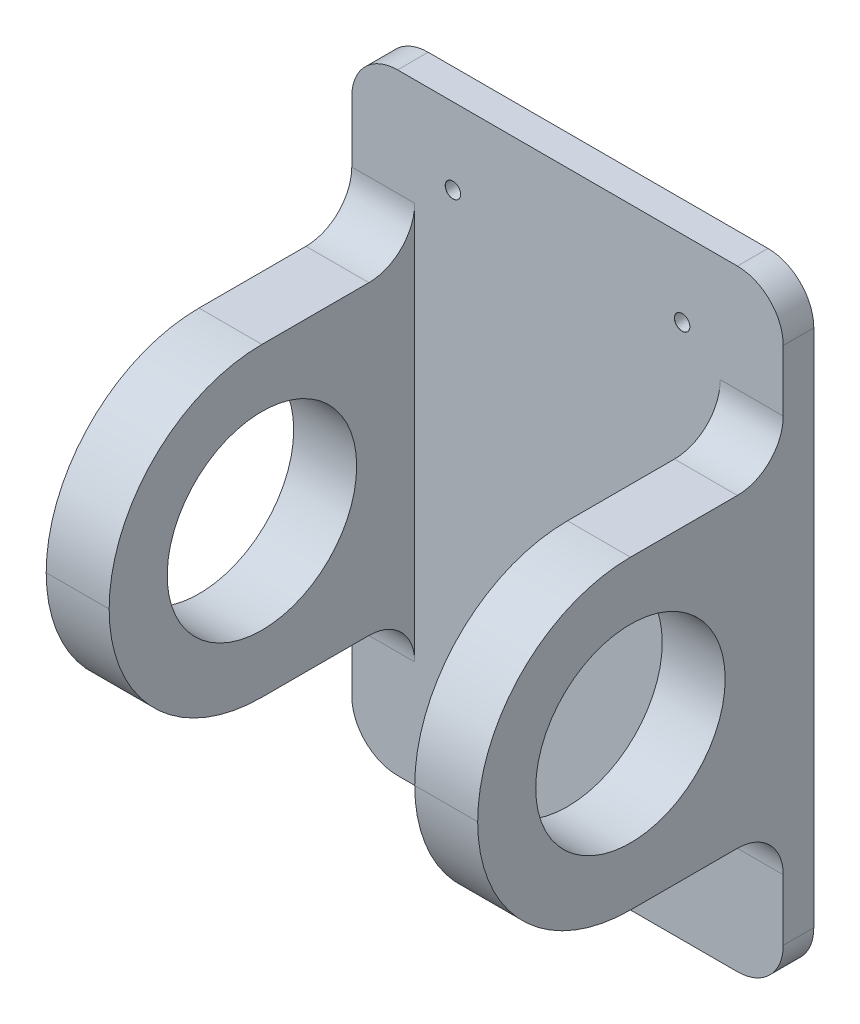
ISO-10303-21;
HEADER;
FILE_DESCRIPTION(('STEP AP214'),'2;1');
FILE_NAME('part.step','',(''),(''),'','','');
FILE_SCHEMA(('AUTOMOTIVE_DESIGN { 1 0 10303 214 1 1 1 1 }'));
ENDSEC;
DATA;
#1=APPLICATION_CONTEXT('core data for automotive mechanical design processes');
#2=APPLICATION_PROTOCOL_DEFINITION('international standard','automotive_design',2000,#1);
#3=PRODUCT_CONTEXT('',#1,'mechanical');
#4=PRODUCT('Part','Part','',(#3));
#5=PRODUCT_RELATED_PRODUCT_CATEGORY('part','',(#4));
#6=PRODUCT_DEFINITION_FORMATION('','',#4);
#7=PRODUCT_DEFINITION_CONTEXT('part definition',#1,'design');
#8=PRODUCT_DEFINITION('design','',#6,#7);
#9=PRODUCT_DEFINITION_SHAPE('','',#8);
#10=(LENGTH_UNIT() NAMED_UNIT(*) SI_UNIT(.MILLI.,.METRE.));
#11=(NAMED_UNIT(*) PLANE_ANGLE_UNIT() SI_UNIT($,.RADIAN.));
#12=(NAMED_UNIT(*) SI_UNIT($,.STERADIAN.) SOLID_ANGLE_UNIT());
#13=UNCERTAINTY_MEASURE_WITH_UNIT(LENGTH_MEASURE(1.E-05),#10,'distance_accuracy_value','');
#14=(GEOMETRIC_REPRESENTATION_CONTEXT(3) GLOBAL_UNCERTAINTY_ASSIGNED_CONTEXT((#13)) GLOBAL_UNIT_ASSIGNED_CONTEXT((#10,
#11,#12)) REPRESENTATION_CONTEXT('',''));
#15=CARTESIAN_POINT('',(0.,0.,0.));
#16=DIRECTION('',(0.,0.,1.));
#17=DIRECTION('',(1.,0.,0.));
#18=AXIS2_PLACEMENT_3D('',#15,#16,#17);
#19=CARTESIAN_POINT('',(0.,0.,0.));
#20=DIRECTION('',(0.,0.,1.));
#21=DIRECTION('',(1.,0.,0.));
#22=AXIS2_PLACEMENT_3D('',#19,#20,#21);
#23=PLANE('',#22);
#24=CARTESIAN_POINT('',(-37.5,-75.,0.));
#25=DIRECTION('',(0.,0.,1.));
#26=DIRECTION('',(1.,0.,0.));
#27=AXIS2_PLACEMENT_3D('',#24,#25,#26);
#28=CIRCLE('',#27,2.525);
#29=CARTESIAN_POINT('',(-34.975,-75.,0.));
#30=VERTEX_POINT('',#29);
#31=EDGE_CURVE('E414',#30,#30,#28,.T.);
#32=ORIENTED_EDGE('',*,*,#31,.F.);
#33=EDGE_LOOP('',(#32));
#34=FACE_BOUND('',#33,.T.);
#35=CARTESIAN_POINT('',(37.5,-75.,0.));
#36=DIRECTION('',(0.,0.,1.));
#37=DIRECTION('',(1.,0.,0.));
#38=AXIS2_PLACEMENT_3D('',#35,#36,#37);
#39=CIRCLE('',#38,2.525);
#40=CARTESIAN_POINT('',(40.025,-75.,0.));
#41=VERTEX_POINT('',#40);
#42=EDGE_CURVE('E406',#41,#41,#39,.T.);
#43=ORIENTED_EDGE('',*,*,#42,.F.);
#44=EDGE_LOOP('',(#43));
#45=FACE_BOUND('',#44,.T.);
#46=CARTESIAN_POINT('',(-37.5,75.,0.));
#47=DIRECTION('',(0.,0.,1.));
#48=DIRECTION('',(1.,0.,0.));
#49=AXIS2_PLACEMENT_3D('',#46,#47,#48);
#50=CIRCLE('',#49,2.525);
#51=CARTESIAN_POINT('',(-34.975,75.,0.));
#52=VERTEX_POINT('',#51);
#53=EDGE_CURVE('E400',#52,#52,#50,.T.);
#54=ORIENTED_EDGE('',*,*,#53,.F.);
#55=EDGE_LOOP('',(#54));
#56=FACE_BOUND('',#55,.T.);
#57=CARTESIAN_POINT('',(37.5,75.,0.));
#58=DIRECTION('',(0.,0.,1.));
#59=DIRECTION('',(1.,0.,0.));
#60=AXIS2_PLACEMENT_3D('',#57,#58,#59);
#61=CIRCLE('',#60,2.525);
#62=CARTESIAN_POINT('',(40.025,75.,0.));
#63=VERTEX_POINT('',#62);
#64=EDGE_CURVE('E387',#63,#63,#61,.T.);
#65=ORIENTED_EDGE('',*,*,#64,.F.);
#66=EDGE_LOOP('',(#65));
#67=FACE_BOUND('',#66,.T.);
#68=DIRECTION('',(0.,-1.,0.));
#69=VECTOR('',#68,1.);
#70=CARTESIAN_POINT('',(-70.6,-100.,0.));
#71=LINE('',#70,#69);
#72=CARTESIAN_POINT('',(-70.6,-65.,0.));
#73=VERTEX_POINT('',#72);
#74=CARTESIAN_POINT('',(-70.6,-85.,0.));
#75=VERTEX_POINT('',#74);
#76=EDGE_CURVE('E223',#73,#75,#71,.T.);
#77=ORIENTED_EDGE('',*,*,#76,.T.);
#78=CARTESIAN_POINT('',(-55.6,-85.,0.));
#79=DIRECTION('',(0.,0.,1.));
#80=DIRECTION('',(1.,0.,0.));
#81=AXIS2_PLACEMENT_3D('',#78,#79,#80);
#82=CIRCLE('',#81,15.);
#83=CARTESIAN_POINT('',(-55.6,-100.,0.));
#84=VERTEX_POINT('',#83);
#85=EDGE_CURVE('E276',#75,#84,#82,.T.);
#86=ORIENTED_EDGE('',*,*,#85,.T.);
#87=DIRECTION('',(1.,0.,0.));
#88=VECTOR('',#87,1.);
#89=CARTESIAN_POINT('',(-70.6,-100.,0.));
#90=LINE('',#89,#88);
#91=CARTESIAN_POINT('',(55.6,-100.,0.));
#92=VERTEX_POINT('',#91);
#93=EDGE_CURVE('E348',#84,#92,#90,.T.);
#94=ORIENTED_EDGE('',*,*,#93,.T.);
#95=CARTESIAN_POINT('',(55.6,-85.,0.));
#96=DIRECTION('',(0.,0.,1.));
#97=DIRECTION('',(1.,0.,0.));
#98=AXIS2_PLACEMENT_3D('',#95,#96,#97);
#99=CIRCLE('',#98,15.);
#100=CARTESIAN_POINT('',(70.6,-85.,0.));
#101=VERTEX_POINT('',#100);
#102=EDGE_CURVE('E268',#92,#101,#99,.T.);
#103=ORIENTED_EDGE('',*,*,#102,.T.);
#104=DIRECTION('',(0.,1.,0.));
#105=VECTOR('',#104,1.);
#106=CARTESIAN_POINT('',(70.6,-100.,0.));
#107=LINE('',#106,#105);
#108=CARTESIAN_POINT('',(70.6,-65.,0.));
#109=VERTEX_POINT('',#108);
#110=EDGE_CURVE('E341',#101,#109,#107,.T.);
#111=ORIENTED_EDGE('',*,*,#110,.T.);
#112=DIRECTION('',(1.,0.,0.));
#113=VECTOR('',#112,1.);
#114=CARTESIAN_POINT('',(0.,-65.,0.));
#115=LINE('',#114,#113);
#116=CARTESIAN_POINT('',(50.,-65.,0.));
#117=VERTEX_POINT('',#116);
#118=EDGE_CURVE('E261',#109,#117,#115,.F.);
#119=ORIENTED_EDGE('',*,*,#118,.T.);
#120=DIRECTION('',(0.,1.,0.));
#121=VECTOR('',#120,1.);
#122=CARTESIAN_POINT('',(50.,0.,0.));
#123=LINE('',#122,#121);
#124=CARTESIAN_POINT('',(50.,65.0000000000001,0.));
#125=VERTEX_POINT('',#124);
#126=EDGE_CURVE('E212',#117,#125,#123,.T.);
#127=ORIENTED_EDGE('',*,*,#126,.T.);
#128=DIRECTION('',(1.,0.,0.));
#129=VECTOR('',#128,1.);
#130=CARTESIAN_POINT('',(70.6,65.0000000000001,0.));
#131=LINE('',#130,#129);
#132=CARTESIAN_POINT('',(70.6,65.,0.));
#133=VERTEX_POINT('',#132);
#134=EDGE_CURVE('E270',#125,#133,#131,.T.);
#135=ORIENTED_EDGE('',*,*,#134,.T.);
#136=CARTESIAN_POINT('',(70.6,84.9999999999999,0.));
#137=VERTEX_POINT('',#136);
#138=EDGE_CURVE('E343',#133,#137,#107,.T.);
#139=ORIENTED_EDGE('',*,*,#138,.T.);
#140=CARTESIAN_POINT('',(55.6,85.,0.));
#141=DIRECTION('',(0.,0.,1.));
#142=DIRECTION('',(1.,0.,0.));
#143=AXIS2_PLACEMENT_3D('',#140,#141,#142);
#144=CIRCLE('',#143,15.);
#145=CARTESIAN_POINT('',(55.6,100.,0.));
#146=VERTEX_POINT('',#145);
#147=EDGE_CURVE('E275',#137,#146,#144,.T.);
#148=ORIENTED_EDGE('',*,*,#147,.T.);
#149=DIRECTION('',(-1.,0.,0.));
#150=VECTOR('',#149,1.);
#151=CARTESIAN_POINT('',(-70.6,100.,0.));
#152=LINE('',#151,#150);
#153=CARTESIAN_POINT('',(-55.6,100.,0.));
#154=VERTEX_POINT('',#153);
#155=EDGE_CURVE('E340',#146,#154,#152,.T.);
#156=ORIENTED_EDGE('',*,*,#155,.T.);
#157=CARTESIAN_POINT('',(-55.6,85.,0.));
#158=DIRECTION('',(0.,0.,1.));
#159=DIRECTION('',(1.,0.,0.));
#160=AXIS2_PLACEMENT_3D('',#157,#158,#159);
#161=CIRCLE('',#160,15.);
#162=CARTESIAN_POINT('',(-70.6,84.9999999999999,0.));
#163=VERTEX_POINT('',#162);
#164=EDGE_CURVE('E274',#154,#163,#161,.T.);
#165=ORIENTED_EDGE('',*,*,#164,.T.);
#166=CARTESIAN_POINT('',(-70.6,65.,0.));
#167=VERTEX_POINT('',#166);
#168=EDGE_CURVE('E337',#163,#167,#71,.T.);
#169=ORIENTED_EDGE('',*,*,#168,.T.);
#170=DIRECTION('',(1.,0.,0.));
#171=VECTOR('',#170,1.);
#172=CARTESIAN_POINT('',(-50.,65.,0.));
#173=LINE('',#172,#171);
#174=CARTESIAN_POINT('',(-50.0000000000001,65.,0.));
#175=VERTEX_POINT('',#174);
#176=EDGE_CURVE('E262',#167,#175,#173,.T.);
#177=ORIENTED_EDGE('',*,*,#176,.T.);
#178=DIRECTION('',(0.,1.,0.));
#179=VECTOR('',#178,1.);
#180=CARTESIAN_POINT('',(-50.,0.,0.));
#181=LINE('',#180,#179);
#182=CARTESIAN_POINT('',(-50.,-65.,0.));
#183=VERTEX_POINT('',#182);
#184=EDGE_CURVE('E322',#183,#175,#181,.T.);
#185=ORIENTED_EDGE('',*,*,#184,.F.);
#186=DIRECTION('',(1.,0.,0.));
#187=VECTOR('',#186,1.);
#188=CARTESIAN_POINT('',(0.,-65.,0.));
#189=LINE('',#188,#187);
#190=EDGE_CURVE('E258',#183,#73,#189,.F.);
#191=ORIENTED_EDGE('',*,*,#190,.T.);
#192=EDGE_LOOP('',(#77,#86,#94,#103,#111,#119,#127,#135,#139,#148,#156,#165,#169,#177,#185,#191));
#193=FACE_BOUND('',#192,.T.);
#194=ADVANCED_FACE('F41',(#34,#45,#56,#67,#193),#23,.T.);
#195=CARTESIAN_POINT('',(-70.6,-100.,-10.));
#196=DIRECTION('',(0.,-1.,0.));
#197=DIRECTION('',(0.,0.,-1.));
#198=AXIS2_PLACEMENT_3D('',#195,#196,#197);
#199=PLANE('',#198);
#200=ORIENTED_EDGE('',*,*,#93,.F.);
#201=DIRECTION('',(0.,0.,1.));
#202=VECTOR('',#201,1.);
#203=CARTESIAN_POINT('',(-55.6,-100.,-10.));
#204=LINE('',#203,#202);
#205=CARTESIAN_POINT('',(-55.6,-100.,-10.));
#206=VERTEX_POINT('',#205);
#207=EDGE_CURVE('E281',#84,#206,#204,.F.);
#208=ORIENTED_EDGE('',*,*,#207,.T.);
#209=DIRECTION('',(1.,0.,0.));
#210=VECTOR('',#209,1.);
#211=CARTESIAN_POINT('',(-70.6,-100.,-10.));
#212=LINE('',#211,#210);
#213=CARTESIAN_POINT('',(55.6,-100.,-10.));
#214=VERTEX_POINT('',#213);
#215=EDGE_CURVE('E339',#206,#214,#212,.T.);
#216=ORIENTED_EDGE('',*,*,#215,.T.);
#217=DIRECTION('',(0.,0.,1.));
#218=VECTOR('',#217,1.);
#219=CARTESIAN_POINT('',(55.6,-100.,-10.));
#220=LINE('',#219,#218);
#221=EDGE_CURVE('E277',#214,#92,#220,.T.);
#222=ORIENTED_EDGE('',*,*,#221,.T.);
#223=EDGE_LOOP('',(#200,#208,#216,#222));
#224=FACE_BOUND('',#223,.T.);
#225=ADVANCED_FACE('F421',(#224),#199,.T.);
#226=CARTESIAN_POINT('',(-70.6,-100.,-10.));
#227=DIRECTION('',(-1.,0.,0.));
#228=DIRECTION('',(0.,-1.,0.));
#229=AXIS2_PLACEMENT_3D('',#226,#227,#228);
#230=PLANE('',#229);
#231=CARTESIAN_POINT('',(-70.6,0.,50.));
#232=DIRECTION('',(1.,0.,0.));
#233=DIRECTION('',(0.,0.,-1.));
#234=AXIS2_PLACEMENT_3D('',#231,#232,#233);
#235=CIRCLE('',#234,31.);
#236=CARTESIAN_POINT('',(-70.6,0.,19.));
#237=VERTEX_POINT('',#236);
#238=EDGE_CURVE('E251',#237,#237,#235,.T.);
#239=ORIENTED_EDGE('',*,*,#238,.T.);
#240=EDGE_LOOP('',(#239));
#241=FACE_BOUND('',#240,.T.);
#242=DIRECTION('',(0.,-1.,0.));
#243=VECTOR('',#242,1.);
#244=CARTESIAN_POINT('',(-70.6,-100.,-10.));
#245=LINE('',#244,#243);
#246=CARTESIAN_POINT('',(-70.6,84.9999999999999,-10.));
#247=VERTEX_POINT('',#246);
#248=CARTESIAN_POINT('',(-70.6,-85.,-10.));
#249=VERTEX_POINT('',#248);
#250=EDGE_CURVE('E218',#247,#249,#245,.T.);
#251=ORIENTED_EDGE('',*,*,#250,.T.);
#252=DIRECTION('',(0.,0.,1.));
#253=VECTOR('',#252,1.);
#254=CARTESIAN_POINT('',(-70.6,-85.,-10.));
#255=LINE('',#254,#253);
#256=EDGE_CURVE('E256',#249,#75,#255,.T.);
#257=ORIENTED_EDGE('',*,*,#256,.T.);
#258=ORIENTED_EDGE('',*,*,#76,.F.);
#259=CARTESIAN_POINT('',(-70.6,-65.,15.));
#260=DIRECTION('',(-1.,0.,0.));
#261=DIRECTION('',(0.,-1.,0.));
#262=AXIS2_PLACEMENT_3D('',#259,#260,#261);
#263=CIRCLE('',#262,15.);
#264=CARTESIAN_POINT('',(-70.6,-50.,15.));
#265=VERTEX_POINT('',#264);
#266=EDGE_CURVE('E11',#73,#265,#263,.F.);
#267=ORIENTED_EDGE('',*,*,#266,.T.);
#268=DIRECTION('',(0.,0.,-1.));
#269=VECTOR('',#268,1.);
#270=CARTESIAN_POINT('',(-70.6,-50.,100.));
#271=LINE('',#270,#269);
#272=CARTESIAN_POINT('',(-70.6,-50.,50.));
#273=VERTEX_POINT('',#272);
#274=EDGE_CURVE('E375',#273,#265,#271,.T.);
#275=ORIENTED_EDGE('',*,*,#274,.F.);
#276=CARTESIAN_POINT('',(-70.6,0.,50.));
#277=DIRECTION('',(-1.,0.,0.));
#278=DIRECTION('',(0.,-1.,0.));
#279=AXIS2_PLACEMENT_3D('',#276,#277,#278);
#280=CIRCLE('',#279,50.);
#281=CARTESIAN_POINT('',(-70.6,0.,100.));
#282=VERTEX_POINT('',#281);
#283=EDGE_CURVE('E238',#273,#282,#280,.T.);
#284=ORIENTED_EDGE('',*,*,#283,.T.);
#285=CARTESIAN_POINT('',(-70.6,0.,50.));
#286=DIRECTION('',(-1.,0.,0.));
#287=DIRECTION('',(0.,-1.,0.));
#288=AXIS2_PLACEMENT_3D('',#285,#286,#287);
#289=CIRCLE('',#288,50.);
#290=CARTESIAN_POINT('',(-70.6,50.,50.));
#291=VERTEX_POINT('',#290);
#292=EDGE_CURVE('E239',#282,#291,#289,.T.);
#293=ORIENTED_EDGE('',*,*,#292,.T.);
#294=DIRECTION('',(0.,0.,-1.));
#295=VECTOR('',#294,1.);
#296=CARTESIAN_POINT('',(-70.6,50.,100.));
#297=LINE('',#296,#295);
#298=CARTESIAN_POINT('',(-70.6,50.,15.));
#299=VERTEX_POINT('',#298);
#300=EDGE_CURVE('E367',#291,#299,#297,.T.);
#301=ORIENTED_EDGE('',*,*,#300,.T.);
#302=CARTESIAN_POINT('',(-70.6,65.,15.));
#303=DIRECTION('',(-1.,0.,0.));
#304=DIRECTION('',(0.,-1.,0.));
#305=AXIS2_PLACEMENT_3D('',#302,#303,#304);
#306=CIRCLE('',#305,15.);
#307=EDGE_CURVE('E314',#299,#167,#306,.F.);
#308=ORIENTED_EDGE('',*,*,#307,.T.);
#309=ORIENTED_EDGE('',*,*,#168,.F.);
#310=DIRECTION('',(0.,0.,1.));
#311=VECTOR('',#310,1.);
#312=CARTESIAN_POINT('',(-70.6,85.,-10.));
#313=LINE('',#312,#311);
#314=EDGE_CURVE('E242',#163,#247,#313,.F.);
#315=ORIENTED_EDGE('',*,*,#314,.T.);
#316=EDGE_LOOP('',(#251,#257,#258,#267,#275,#284,#293,#301,#308,#309,#315));
#317=FACE_BOUND('',#316,.T.);
#318=ADVANCED_FACE('F335',(#241,#317),#230,.T.);
#319=CARTESIAN_POINT('',(-70.6,100.,-10.));
#320=DIRECTION('',(0.,1.,0.));
#321=DIRECTION('',(0.,0.,1.));
#322=AXIS2_PLACEMENT_3D('',#319,#320,#321);
#323=PLANE('',#322);
#324=DIRECTION('',(-1.,0.,0.));
#325=VECTOR('',#324,1.);
#326=CARTESIAN_POINT('',(-70.6,100.,-10.));
#327=LINE('',#326,#325);
#328=CARTESIAN_POINT('',(55.6,100.,-10.));
#329=VERTEX_POINT('',#328);
#330=CARTESIAN_POINT('',(-55.6,100.,-10.));
#331=VERTEX_POINT('',#330);
#332=EDGE_CURVE('E225',#329,#331,#327,.T.);
#333=ORIENTED_EDGE('',*,*,#332,.T.);
#334=DIRECTION('',(0.,0.,1.));
#335=VECTOR('',#334,1.);
#336=CARTESIAN_POINT('',(-55.6,100.,-10.));
#337=LINE('',#336,#335);
#338=EDGE_CURVE('E291',#331,#154,#337,.T.);
#339=ORIENTED_EDGE('',*,*,#338,.T.);
#340=ORIENTED_EDGE('',*,*,#155,.F.);
#341=DIRECTION('',(0.,0.,1.));
#342=VECTOR('',#341,1.);
#343=CARTESIAN_POINT('',(55.6,100.,-10.));
#344=LINE('',#343,#342);
#345=EDGE_CURVE('E293',#146,#329,#344,.F.);
#346=ORIENTED_EDGE('',*,*,#345,.T.);
#347=EDGE_LOOP('',(#333,#339,#340,#346));
#348=FACE_BOUND('',#347,.T.);
#349=ADVANCED_FACE('F484',(#348),#323,.T.);
#350=CARTESIAN_POINT('',(70.6,-100.,-10.));
#351=DIRECTION('',(1.,0.,0.));
#352=DIRECTION('',(0.,1.,0.));
#353=AXIS2_PLACEMENT_3D('',#350,#351,#352);
#354=PLANE('',#353);
#355=CARTESIAN_POINT('',(70.6,0.,50.));
#356=DIRECTION('',(1.,0.,0.));
#357=DIRECTION('',(0.,0.,-1.));
#358=AXIS2_PLACEMENT_3D('',#355,#356,#357);
#359=CIRCLE('',#358,31.);
#360=CARTESIAN_POINT('',(70.6,0.,19.));
#361=VERTEX_POINT('',#360);
#362=EDGE_CURVE('E378',#361,#361,#359,.T.);
#363=ORIENTED_EDGE('',*,*,#362,.F.);
#364=EDGE_LOOP('',(#363));
#365=FACE_BOUND('',#364,.T.);
#366=DIRECTION('',(0.,1.,0.));
#367=VECTOR('',#366,1.);
#368=CARTESIAN_POINT('',(70.6,-100.,-10.));
#369=LINE('',#368,#367);
#370=CARTESIAN_POINT('',(70.6,-85.,-10.));
#371=VERTEX_POINT('',#370);
#372=CARTESIAN_POINT('',(70.6,84.9999999999999,-10.));
#373=VERTEX_POINT('',#372);
#374=EDGE_CURVE('E354',#371,#373,#369,.T.);
#375=ORIENTED_EDGE('',*,*,#374,.T.);
#376=DIRECTION('',(0.,0.,1.));
#377=VECTOR('',#376,1.);
#378=CARTESIAN_POINT('',(70.6,85.,-10.));
#379=LINE('',#378,#377);
#380=EDGE_CURVE('E296',#373,#137,#379,.T.);
#381=ORIENTED_EDGE('',*,*,#380,.T.);
#382=ORIENTED_EDGE('',*,*,#138,.F.);
#383=CARTESIAN_POINT('',(70.6,65.0000000000001,15.));
#384=DIRECTION('',(1.,0.,0.));
#385=DIRECTION('',(0.,1.,0.));
#386=AXIS2_PLACEMENT_3D('',#383,#384,#385);
#387=CIRCLE('',#386,15.);
#388=CARTESIAN_POINT('',(70.5999999999999,50.,15.));
#389=VERTEX_POINT('',#388);
#390=EDGE_CURVE('E307',#133,#389,#387,.F.);
#391=ORIENTED_EDGE('',*,*,#390,.T.);
#392=DIRECTION('',(0.,0.,-1.));
#393=VECTOR('',#392,1.);
#394=CARTESIAN_POINT('',(70.5999999999999,50.,100.));
#395=LINE('',#394,#393);
#396=CARTESIAN_POINT('',(70.5999999999999,50.,50.));
#397=VERTEX_POINT('',#396);
#398=EDGE_CURVE('E215',#397,#389,#395,.T.);
#399=ORIENTED_EDGE('',*,*,#398,.F.);
#400=CARTESIAN_POINT('',(70.6,0.,50.));
#401=DIRECTION('',(1.,0.,0.));
#402=DIRECTION('',(0.,1.,0.));
#403=AXIS2_PLACEMENT_3D('',#400,#401,#402);
#404=CIRCLE('',#403,50.);
#405=CARTESIAN_POINT('',(70.6,0.,100.));
#406=VERTEX_POINT('',#405);
#407=EDGE_CURVE('E216',#397,#406,#404,.T.);
#408=ORIENTED_EDGE('',*,*,#407,.T.);
#409=CARTESIAN_POINT('',(70.6,0.,50.));
#410=DIRECTION('',(1.,0.,0.));
#411=DIRECTION('',(0.,1.,0.));
#412=AXIS2_PLACEMENT_3D('',#409,#410,#411);
#413=CIRCLE('',#412,50.);
#414=CARTESIAN_POINT('',(70.6,-50.,50.));
#415=VERTEX_POINT('',#414);
#416=EDGE_CURVE('E220',#406,#415,#413,.T.);
#417=ORIENTED_EDGE('',*,*,#416,.T.);
#418=DIRECTION('',(0.,0.,-1.));
#419=VECTOR('',#418,1.);
#420=CARTESIAN_POINT('',(70.6,-50.,100.));
#421=LINE('',#420,#419);
#422=CARTESIAN_POINT('',(70.6,-50.,15.));
#423=VERTEX_POINT('',#422);
#424=EDGE_CURVE('E359',#415,#423,#421,.T.);
#425=ORIENTED_EDGE('',*,*,#424,.T.);
#426=CARTESIAN_POINT('',(70.6,-65.,15.));
#427=DIRECTION('',(1.,0.,0.));
#428=DIRECTION('',(0.,1.,0.));
#429=AXIS2_PLACEMENT_3D('',#426,#427,#428);
#430=CIRCLE('',#429,15.);
#431=EDGE_CURVE('E320',#423,#109,#430,.F.);
#432=ORIENTED_EDGE('',*,*,#431,.T.);
#433=ORIENTED_EDGE('',*,*,#110,.F.);
#434=DIRECTION('',(0.,0.,1.));
#435=VECTOR('',#434,1.);
#436=CARTESIAN_POINT('',(70.6,-85.,-10.));
#437=LINE('',#436,#435);
#438=EDGE_CURVE('E298',#101,#371,#437,.F.);
#439=ORIENTED_EDGE('',*,*,#438,.T.);
#440=EDGE_LOOP('',(#375,#381,#382,#391,#399,#408,#417,#425,#432,#433,#439));
#441=FACE_BOUND('',#440,.T.);
#442=ADVANCED_FACE('F478',(#365,#441),#354,.T.);
#443=CARTESIAN_POINT('',(0.,0.,-10.));
#444=DIRECTION('',(0.,0.,1.));
#445=DIRECTION('',(1.,0.,0.));
#446=AXIS2_PLACEMENT_3D('',#443,#444,#445);
#447=PLANE('',#446);
#448=CARTESIAN_POINT('',(-37.5,-75.,-10.));
#449=DIRECTION('',(0.,0.,1.));
#450=DIRECTION('',(1.,0.,0.));
#451=AXIS2_PLACEMENT_3D('',#448,#449,#450);
#452=CIRCLE('',#451,2.5);
#453=CARTESIAN_POINT('',(-35.,-75.,-10.));
#454=VERTEX_POINT('',#453);
#455=EDGE_CURVE('E408',#454,#454,#452,.T.);
#456=ORIENTED_EDGE('',*,*,#455,.T.);
#457=EDGE_LOOP('',(#456));
#458=FACE_BOUND('',#457,.T.);
#459=CARTESIAN_POINT('',(37.5,-75.,-10.));
#460=DIRECTION('',(0.,0.,1.));
#461=DIRECTION('',(1.,0.,0.));
#462=AXIS2_PLACEMENT_3D('',#459,#460,#461);
#463=CIRCLE('',#462,2.5);
#464=CARTESIAN_POINT('',(40.,-75.,-10.));
#465=VERTEX_POINT('',#464);
#466=EDGE_CURVE('E398',#465,#465,#463,.T.);
#467=ORIENTED_EDGE('',*,*,#466,.T.);
#468=EDGE_LOOP('',(#467));
#469=FACE_BOUND('',#468,.T.);
#470=CARTESIAN_POINT('',(-37.5,75.,-10.));
#471=DIRECTION('',(0.,0.,1.));
#472=DIRECTION('',(1.,0.,0.));
#473=AXIS2_PLACEMENT_3D('',#470,#471,#472);
#474=CIRCLE('',#473,2.5);
#475=CARTESIAN_POINT('',(-35.,75.,-10.));
#476=VERTEX_POINT('',#475);
#477=EDGE_CURVE('E391',#476,#476,#474,.T.);
#478=ORIENTED_EDGE('',*,*,#477,.T.);
#479=EDGE_LOOP('',(#478));
#480=FACE_BOUND('',#479,.T.);
#481=CARTESIAN_POINT('',(37.5,75.,-10.));
#482=DIRECTION('',(0.,0.,1.));
#483=DIRECTION('',(1.,0.,0.));
#484=AXIS2_PLACEMENT_3D('',#481,#482,#483);
#485=CIRCLE('',#484,2.5);
#486=CARTESIAN_POINT('',(40.,75.,-10.));
#487=VERTEX_POINT('',#486);
#488=EDGE_CURVE('E385',#487,#487,#485,.T.);
#489=ORIENTED_EDGE('',*,*,#488,.T.);
#490=EDGE_LOOP('',(#489));
#491=FACE_BOUND('',#490,.T.);
#492=ORIENTED_EDGE('',*,*,#215,.F.);
#493=CARTESIAN_POINT('',(-55.6,-85.,-10.));
#494=DIRECTION('',(0.,0.,1.));
#495=DIRECTION('',(1.,0.,0.));
#496=AXIS2_PLACEMENT_3D('',#493,#494,#495);
#497=CIRCLE('',#496,15.);
#498=EDGE_CURVE('E286',#206,#249,#497,.F.);
#499=ORIENTED_EDGE('',*,*,#498,.T.);
#500=ORIENTED_EDGE('',*,*,#250,.F.);
#501=CARTESIAN_POINT('',(-55.6,85.,-10.));
#502=DIRECTION('',(0.,0.,1.));
#503=DIRECTION('',(1.,0.,0.));
#504=AXIS2_PLACEMENT_3D('',#501,#502,#503);
#505=CIRCLE('',#504,15.);
#506=EDGE_CURVE('E290',#247,#331,#505,.F.);
#507=ORIENTED_EDGE('',*,*,#506,.T.);
#508=ORIENTED_EDGE('',*,*,#332,.F.);
#509=CARTESIAN_POINT('',(55.6,85.,-10.));
#510=DIRECTION('',(0.,0.,1.));
#511=DIRECTION('',(1.,0.,0.));
#512=AXIS2_PLACEMENT_3D('',#509,#510,#511);
#513=CIRCLE('',#512,15.);
#514=EDGE_CURVE('E284',#329,#373,#513,.F.);
#515=ORIENTED_EDGE('',*,*,#514,.T.);
#516=ORIENTED_EDGE('',*,*,#374,.F.);
#517=CARTESIAN_POINT('',(55.6,-85.,-10.));
#518=DIRECTION('',(0.,0.,1.));
#519=DIRECTION('',(1.,0.,0.));
#520=AXIS2_PLACEMENT_3D('',#517,#518,#519);
#521=CIRCLE('',#520,15.);
#522=EDGE_CURVE('E283',#371,#214,#521,.F.);
#523=ORIENTED_EDGE('',*,*,#522,.T.);
#524=EDGE_LOOP('',(#492,#499,#500,#507,#508,#515,#516,#523));
#525=FACE_BOUND('',#524,.T.);
#526=ADVANCED_FACE('F474',(#458,#469,#480,#491,#525),#447,.F.);
#527=CARTESIAN_POINT('',(50.,0.,100.));
#528=DIRECTION('',(-1.,0.,0.));
#529=DIRECTION('',(0.,-1.,0.));
#530=AXIS2_PLACEMENT_3D('',#527,#528,#529);
#531=PLANE('',#530);
#532=CARTESIAN_POINT('',(50.,0.,50.));
#533=DIRECTION('',(-1.,0.,0.));
#534=DIRECTION('',(0.,-1.,0.));
#535=AXIS2_PLACEMENT_3D('',#532,#533,#534);
#536=CIRCLE('',#535,31.);
#537=CARTESIAN_POINT('',(50.,-30.9999999999999,50.));
#538=VERTEX_POINT('',#537);
#539=EDGE_CURVE('E252',#538,#538,#536,.T.);
#540=ORIENTED_EDGE('',*,*,#539,.F.);
#541=EDGE_LOOP('',(#540));
#542=FACE_BOUND('',#541,.T.);
#543=CARTESIAN_POINT('',(50.,0.,50.));
#544=DIRECTION('',(-1.,0.,0.));
#545=DIRECTION('',(0.,-1.,0.));
#546=AXIS2_PLACEMENT_3D('',#543,#544,#545);
#547=CIRCLE('',#546,50.);
#548=CARTESIAN_POINT('',(50.,-50.,50.));
#549=VERTEX_POINT('',#548);
#550=CARTESIAN_POINT('',(50.,0.,100.));
#551=VERTEX_POINT('',#550);
#552=EDGE_CURVE('E200',#549,#551,#547,.T.);
#553=ORIENTED_EDGE('',*,*,#552,.T.);
#554=CARTESIAN_POINT('',(50.,0.,50.));
#555=DIRECTION('',(-1.,0.,0.));
#556=DIRECTION('',(0.,-1.,0.));
#557=AXIS2_PLACEMENT_3D('',#554,#555,#556);
#558=CIRCLE('',#557,50.);
#559=CARTESIAN_POINT('',(50.,50.,50.));
#560=VERTEX_POINT('',#559);
#561=EDGE_CURVE('E188',#551,#560,#558,.T.);
#562=ORIENTED_EDGE('',*,*,#561,.T.);
#563=DIRECTION('',(0.,0.,-1.));
#564=VECTOR('',#563,1.);
#565=CARTESIAN_POINT('',(50.,50.,100.));
#566=LINE('',#565,#564);
#567=CARTESIAN_POINT('',(50.,50.,15.));
#568=VERTEX_POINT('',#567);
#569=EDGE_CURVE('E193',#560,#568,#566,.T.);
#570=ORIENTED_EDGE('',*,*,#569,.T.);
#571=CARTESIAN_POINT('',(50.,65.,15.));
#572=DIRECTION('',(-1.,0.,0.));
#573=DIRECTION('',(0.,-1.,0.));
#574=AXIS2_PLACEMENT_3D('',#571,#572,#573);
#575=CIRCLE('',#574,15.);
#576=EDGE_CURVE('E311',#568,#125,#575,.F.);
#577=ORIENTED_EDGE('',*,*,#576,.T.);
#578=ORIENTED_EDGE('',*,*,#126,.F.);
#579=CARTESIAN_POINT('',(50.,-65.,15.));
#580=DIRECTION('',(-1.,0.,0.));
#581=DIRECTION('',(0.,-1.,0.));
#582=AXIS2_PLACEMENT_3D('',#579,#580,#581);
#583=CIRCLE('',#582,15.);
#584=CARTESIAN_POINT('',(50.,-50.,15.));
#585=VERTEX_POINT('',#584);
#586=EDGE_CURVE('E62',#117,#585,#583,.F.);
#587=ORIENTED_EDGE('',*,*,#586,.T.);
#588=DIRECTION('',(0.,0.,-1.));
#589=VECTOR('',#588,1.);
#590=CARTESIAN_POINT('',(50.,-50.,100.));
#591=LINE('',#590,#589);
#592=EDGE_CURVE('E356',#549,#585,#591,.T.);
#593=ORIENTED_EDGE('',*,*,#592,.F.);
#594=EDGE_LOOP('',(#553,#562,#570,#577,#578,#587,#593));
#595=FACE_BOUND('',#594,.T.);
#596=ADVANCED_FACE('F195',(#542,#595),#531,.T.);
#597=CARTESIAN_POINT('',(0.,-50.,100.));
#598=DIRECTION('',(0.,1.,0.));
#599=DIRECTION('',(-1.,0.,0.));
#600=AXIS2_PLACEMENT_3D('',#597,#598,#599);
#601=PLANE('',#600);
#602=ORIENTED_EDGE('',*,*,#592,.T.);
#603=DIRECTION('',(1.,0.,0.));
#604=VECTOR('',#603,1.);
#605=CARTESIAN_POINT('',(0.,-50.,15.));
#606=LINE('',#605,#604);
#607=EDGE_CURVE('E302',#585,#423,#606,.T.);
#608=ORIENTED_EDGE('',*,*,#607,.T.);
#609=ORIENTED_EDGE('',*,*,#424,.F.);
#610=DIRECTION('',(1.,0.,0.));
#611=VECTOR('',#610,1.);
#612=CARTESIAN_POINT('',(50.,-50.,50.));
#613=LINE('',#612,#611);
#614=EDGE_CURVE('E205',#415,#549,#613,.F.);
#615=ORIENTED_EDGE('',*,*,#614,.T.);
#616=EDGE_LOOP('',(#602,#608,#609,#615));
#617=FACE_BOUND('',#616,.T.);
#618=ADVANCED_FACE('F469',(#617),#601,.F.);
#619=CARTESIAN_POINT('',(0.,50.,100.));
#620=DIRECTION('',(0.,1.,0.));
#621=DIRECTION('',(-1.,0.,0.));
#622=AXIS2_PLACEMENT_3D('',#619,#620,#621);
#623=PLANE('',#622);
#624=ORIENTED_EDGE('',*,*,#398,.T.);
#625=DIRECTION('',(1.,0.,0.));
#626=VECTOR('',#625,1.);
#627=CARTESIAN_POINT('',(50.,50.,15.));
#628=LINE('',#627,#626);
#629=EDGE_CURVE('E211',#389,#568,#628,.F.);
#630=ORIENTED_EDGE('',*,*,#629,.T.);
#631=ORIENTED_EDGE('',*,*,#569,.F.);
#632=DIRECTION('',(1.,0.,0.));
#633=VECTOR('',#632,1.);
#634=CARTESIAN_POINT('',(0.,50.,50.));
#635=LINE('',#634,#633);
#636=EDGE_CURVE('E206',#560,#397,#635,.T.);
#637=ORIENTED_EDGE('',*,*,#636,.T.);
#638=EDGE_LOOP('',(#624,#630,#631,#637));
#639=FACE_BOUND('',#638,.T.);
#640=ADVANCED_FACE('F210',(#639),#623,.T.);
#641=CARTESIAN_POINT('',(0.,-50.,100.));
#642=DIRECTION('',(0.,1.,0.));
#643=DIRECTION('',(-1.,0.,0.));
#644=AXIS2_PLACEMENT_3D('',#641,#642,#643);
#645=PLANE('',#644);
#646=ORIENTED_EDGE('',*,*,#274,.T.);
#647=DIRECTION('',(1.,0.,0.));
#648=VECTOR('',#647,1.);
#649=CARTESIAN_POINT('',(0.,-50.,15.));
#650=LINE('',#649,#648);
#651=CARTESIAN_POINT('',(-50.,-50.,15.));
#652=VERTEX_POINT('',#651);
#653=EDGE_CURVE('E310',#265,#652,#650,.T.);
#654=ORIENTED_EDGE('',*,*,#653,.T.);
#655=DIRECTION('',(0.,0.,-1.));
#656=VECTOR('',#655,1.);
#657=CARTESIAN_POINT('',(-50.,-50.,100.));
#658=LINE('',#657,#656);
#659=CARTESIAN_POINT('',(-50.,-50.,50.));
#660=VERTEX_POINT('',#659);
#661=EDGE_CURVE('E326',#660,#652,#658,.T.);
#662=ORIENTED_EDGE('',*,*,#661,.F.);
#663=DIRECTION('',(1.,0.,0.));
#664=VECTOR('',#663,1.);
#665=CARTESIAN_POINT('',(-70.6,-50.,50.));
#666=LINE('',#665,#664);
#667=EDGE_CURVE('E245',#660,#273,#666,.F.);
#668=ORIENTED_EDGE('',*,*,#667,.T.);
#669=EDGE_LOOP('',(#646,#654,#662,#668));
#670=FACE_BOUND('',#669,.T.);
#671=ADVANCED_FACE('F465',(#670),#645,.F.);
#672=CARTESIAN_POINT('',(-50.,0.,100.));
#673=DIRECTION('',(-1.,0.,0.));
#674=DIRECTION('',(0.,-1.,0.));
#675=AXIS2_PLACEMENT_3D('',#672,#673,#674);
#676=PLANE('',#675);
#677=CARTESIAN_POINT('',(-50.,0.,50.));
#678=DIRECTION('',(-1.,0.,0.));
#679=DIRECTION('',(0.,-1.,0.));
#680=AXIS2_PLACEMENT_3D('',#677,#678,#679);
#681=CIRCLE('',#680,31.);
#682=CARTESIAN_POINT('',(-50.,-30.9999999999999,50.));
#683=VERTEX_POINT('',#682);
#684=EDGE_CURVE('E249',#683,#683,#681,.T.);
#685=ORIENTED_EDGE('',*,*,#684,.T.);
#686=EDGE_LOOP('',(#685));
#687=FACE_BOUND('',#686,.T.);
#688=DIRECTION('',(0.,0.,-1.));
#689=VECTOR('',#688,1.);
#690=CARTESIAN_POINT('',(-50.,50.,100.));
#691=LINE('',#690,#689);
#692=CARTESIAN_POINT('',(-50.,50.,50.));
#693=VERTEX_POINT('',#692);
#694=CARTESIAN_POINT('',(-50.,50.,15.));
#695=VERTEX_POINT('',#694);
#696=EDGE_CURVE('E366',#693,#695,#691,.T.);
#697=ORIENTED_EDGE('',*,*,#696,.F.);
#698=CARTESIAN_POINT('',(-50.,0.,50.));
#699=DIRECTION('',(-1.,0.,0.));
#700=DIRECTION('',(0.,-1.,0.));
#701=AXIS2_PLACEMENT_3D('',#698,#699,#700);
#702=CIRCLE('',#701,50.);
#703=CARTESIAN_POINT('',(-50.,0.,100.));
#704=VERTEX_POINT('',#703);
#705=EDGE_CURVE('E236',#693,#704,#702,.F.);
#706=ORIENTED_EDGE('',*,*,#705,.T.);
#707=CARTESIAN_POINT('',(-50.,0.,50.));
#708=DIRECTION('',(-1.,0.,0.));
#709=DIRECTION('',(0.,-1.,0.));
#710=AXIS2_PLACEMENT_3D('',#707,#708,#709);
#711=CIRCLE('',#710,50.);
#712=EDGE_CURVE('E234',#704,#660,#711,.F.);
#713=ORIENTED_EDGE('',*,*,#712,.T.);
#714=ORIENTED_EDGE('',*,*,#661,.T.);
#715=CARTESIAN_POINT('',(-50.,-65.,15.));
#716=DIRECTION('',(-1.,0.,0.));
#717=DIRECTION('',(0.,-1.,0.));
#718=AXIS2_PLACEMENT_3D('',#715,#716,#717);
#719=CIRCLE('',#718,15.);
#720=EDGE_CURVE('E47',#652,#183,#719,.T.);
#721=ORIENTED_EDGE('',*,*,#720,.T.);
#722=ORIENTED_EDGE('',*,*,#184,.T.);
#723=CARTESIAN_POINT('',(-50.0000000000001,65.,15.));
#724=DIRECTION('',(-1.,0.,0.));
#725=DIRECTION('',(0.,-1.,0.));
#726=AXIS2_PLACEMENT_3D('',#723,#724,#725);
#727=CIRCLE('',#726,15.);
#728=EDGE_CURVE('E312',#175,#695,#727,.T.);
#729=ORIENTED_EDGE('',*,*,#728,.T.);
#730=EDGE_LOOP('',(#697,#706,#713,#714,#721,#722,#729));
#731=FACE_BOUND('',#730,.T.);
#732=ADVANCED_FACE('F325',(#687,#731),#676,.F.);
#733=CARTESIAN_POINT('',(0.,50.,100.));
#734=DIRECTION('',(0.,1.,0.));
#735=DIRECTION('',(-1.,0.,0.));
#736=AXIS2_PLACEMENT_3D('',#733,#734,#735);
#737=PLANE('',#736);
#738=ORIENTED_EDGE('',*,*,#696,.T.);
#739=DIRECTION('',(1.,0.,0.));
#740=VECTOR('',#739,1.);
#741=CARTESIAN_POINT('',(-70.6,50.,15.));
#742=LINE('',#741,#740);
#743=EDGE_CURVE('E305',#695,#299,#742,.F.);
#744=ORIENTED_EDGE('',*,*,#743,.T.);
#745=ORIENTED_EDGE('',*,*,#300,.F.);
#746=DIRECTION('',(1.,0.,0.));
#747=VECTOR('',#746,1.);
#748=CARTESIAN_POINT('',(0.,50.,50.));
#749=LINE('',#748,#747);
#750=EDGE_CURVE('E233',#291,#693,#749,.T.);
#751=ORIENTED_EDGE('',*,*,#750,.T.);
#752=EDGE_LOOP('',(#738,#744,#745,#751));
#753=FACE_BOUND('',#752,.T.);
#754=ADVANCED_FACE('F454',(#753),#737,.T.);
#755=CARTESIAN_POINT('',(0.,0.,50.));
#756=DIRECTION('',(-1.,0.,0.));
#757=DIRECTION('',(0.,-1.,0.));
#758=AXIS2_PLACEMENT_3D('',#755,#756,#757);
#759=CYLINDRICAL_SURFACE('',#758,50.);
#760=DIRECTION('',(1.,0.,0.));
#761=VECTOR('',#760,1.);
#762=CARTESIAN_POINT('',(70.6,0.,100.));
#763=LINE('',#762,#761);
#764=EDGE_CURVE('E244',#551,#406,#763,.T.);
#765=ORIENTED_EDGE('',*,*,#764,.F.);
#766=ORIENTED_EDGE('',*,*,#552,.F.);
#767=ORIENTED_EDGE('',*,*,#614,.F.);
#768=ORIENTED_EDGE('',*,*,#416,.F.);
#769=EDGE_LOOP('',(#765,#766,#767,#768));
#770=FACE_BOUND('',#769,.T.);
#771=ADVANCED_FACE('F458',(#770),#759,.T.);
#772=CARTESIAN_POINT('',(0.,0.,50.));
#773=DIRECTION('',(1.,0.,0.));
#774=DIRECTION('',(0.,1.,0.));
#775=AXIS2_PLACEMENT_3D('',#772,#773,#774);
#776=CYLINDRICAL_SURFACE('',#775,50.);
#777=ORIENTED_EDGE('',*,*,#561,.F.);
#778=ORIENTED_EDGE('',*,*,#764,.T.);
#779=ORIENTED_EDGE('',*,*,#407,.F.);
#780=ORIENTED_EDGE('',*,*,#636,.F.);
#781=EDGE_LOOP('',(#777,#778,#779,#780));
#782=FACE_BOUND('',#781,.T.);
#783=ADVANCED_FACE('F214',(#782),#776,.T.);
#784=CARTESIAN_POINT('',(0.,0.,50.));
#785=DIRECTION('',(-1.,0.,0.));
#786=DIRECTION('',(0.,-1.,0.));
#787=AXIS2_PLACEMENT_3D('',#784,#785,#786);
#788=CYLINDRICAL_SURFACE('',#787,50.);
#789=DIRECTION('',(1.,0.,0.));
#790=VECTOR('',#789,1.);
#791=CARTESIAN_POINT('',(-50.0000000000001,0.,100.));
#792=LINE('',#791,#790);
#793=EDGE_CURVE('E250',#282,#704,#792,.T.);
#794=ORIENTED_EDGE('',*,*,#793,.F.);
#795=ORIENTED_EDGE('',*,*,#283,.F.);
#796=ORIENTED_EDGE('',*,*,#667,.F.);
#797=ORIENTED_EDGE('',*,*,#712,.F.);
#798=EDGE_LOOP('',(#794,#795,#796,#797));
#799=FACE_BOUND('',#798,.T.);
#800=ADVANCED_FACE('F496',(#799),#788,.T.);
#801=CARTESIAN_POINT('',(0.,0.,50.));
#802=DIRECTION('',(1.,0.,0.));
#803=DIRECTION('',(0.,1.,0.));
#804=AXIS2_PLACEMENT_3D('',#801,#802,#803);
#805=CYLINDRICAL_SURFACE('',#804,50.);
#806=ORIENTED_EDGE('',*,*,#292,.F.);
#807=ORIENTED_EDGE('',*,*,#793,.T.);
#808=ORIENTED_EDGE('',*,*,#705,.F.);
#809=ORIENTED_EDGE('',*,*,#750,.F.);
#810=EDGE_LOOP('',(#806,#807,#808,#809));
#811=FACE_BOUND('',#810,.T.);
#812=ADVANCED_FACE('F452',(#811),#805,.T.);
#813=CARTESIAN_POINT('',(70.6,0.,50.));
#814=DIRECTION('',(1.,0.,0.));
#815=DIRECTION('',(0.,0.,-1.));
#816=AXIS2_PLACEMENT_3D('',#813,#814,#815);
#817=CYLINDRICAL_SURFACE('',#816,31.);
#818=ORIENTED_EDGE('',*,*,#539,.T.);
#819=EDGE_LOOP('',(#818));
#820=FACE_BOUND('',#819,.T.);
#821=ORIENTED_EDGE('',*,*,#362,.T.);
#822=EDGE_LOOP('',(#821));
#823=FACE_BOUND('',#822,.T.);
#824=ADVANCED_FACE('F448',(#820,#823),#817,.F.);
#825=ORIENTED_EDGE('',*,*,#238,.F.);
#826=EDGE_LOOP('',(#825));
#827=FACE_BOUND('',#826,.T.);
#828=ORIENTED_EDGE('',*,*,#684,.F.);
#829=EDGE_LOOP('',(#828));
#830=FACE_BOUND('',#829,.T.);
#831=ADVANCED_FACE('F443',(#827,#830),#817,.F.);
#832=CARTESIAN_POINT('',(37.5,75.,0.));
#833=DIRECTION('',(0.,0.,1.));
#834=DIRECTION('',(1.,0.,0.));
#835=AXIS2_PLACEMENT_3D('',#832,#833,#834);
#836=CYLINDRICAL_SURFACE('',#835,2.5);
#837=ORIENTED_EDGE('',*,*,#488,.F.);
#838=EDGE_LOOP('',(#837));
#839=FACE_BOUND('',#838,.T.);
#840=CARTESIAN_POINT('',(37.5,75.,-0.024999999999999));
#841=DIRECTION('',(0.,0.,1.));
#842=DIRECTION('',(1.,0.,0.));
#843=AXIS2_PLACEMENT_3D('',#840,#841,#842);
#844=CIRCLE('',#843,2.5);
#845=CARTESIAN_POINT('',(40.,75.,-0.024999999999999));
#846=VERTEX_POINT('',#845);
#847=EDGE_CURVE('E383',#846,#846,#844,.T.);
#848=ORIENTED_EDGE('',*,*,#847,.T.);
#849=EDGE_LOOP('',(#848));
#850=FACE_BOUND('',#849,.T.);
#851=ADVANCED_FACE('F432',(#839,#850),#836,.F.);
#852=CARTESIAN_POINT('',(37.5,75.,0.));
#853=DIRECTION('',(0.,0.,1.));
#854=DIRECTION('',(1.,0.,0.));
#855=AXIS2_PLACEMENT_3D('',#852,#853,#854);
#856=CONICAL_SURFACE('',#855,2.525,0.785398163397414);
#857=ORIENTED_EDGE('',*,*,#847,.F.);
#858=EDGE_LOOP('',(#857));
#859=FACE_BOUND('',#858,.T.);
#860=ORIENTED_EDGE('',*,*,#64,.T.);
#861=EDGE_LOOP('',(#860));
#862=FACE_BOUND('',#861,.T.);
#863=ADVANCED_FACE('F431',(#859,#862),#856,.F.);
#864=CARTESIAN_POINT('',(-37.5,75.,0.));
#865=DIRECTION('',(0.,0.,1.));
#866=DIRECTION('',(1.,0.,0.));
#867=AXIS2_PLACEMENT_3D('',#864,#865,#866);
#868=CYLINDRICAL_SURFACE('',#867,2.5);
#869=ORIENTED_EDGE('',*,*,#477,.F.);
#870=EDGE_LOOP('',(#869));
#871=FACE_BOUND('',#870,.T.);
#872=CARTESIAN_POINT('',(-37.5,75.,-0.024999999999999));
#873=DIRECTION('',(0.,0.,1.));
#874=DIRECTION('',(1.,0.,0.));
#875=AXIS2_PLACEMENT_3D('',#872,#873,#874);
#876=CIRCLE('',#875,2.5);
#877=CARTESIAN_POINT('',(-35.,75.,-0.024999999999999));
#878=VERTEX_POINT('',#877);
#879=EDGE_CURVE('E392',#878,#878,#876,.T.);
#880=ORIENTED_EDGE('',*,*,#879,.T.);
#881=EDGE_LOOP('',(#880));
#882=FACE_BOUND('',#881,.T.);
#883=ADVANCED_FACE('F433',(#871,#882),#868,.F.);
#884=CARTESIAN_POINT('',(-37.5,75.,0.));
#885=DIRECTION('',(0.,0.,1.));
#886=DIRECTION('',(1.,0.,0.));
#887=AXIS2_PLACEMENT_3D('',#884,#885,#886);
#888=CONICAL_SURFACE('',#887,2.525,0.785398163397414);
#889=ORIENTED_EDGE('',*,*,#879,.F.);
#890=EDGE_LOOP('',(#889));
#891=FACE_BOUND('',#890,.T.);
#892=ORIENTED_EDGE('',*,*,#53,.T.);
#893=EDGE_LOOP('',(#892));
#894=FACE_BOUND('',#893,.T.);
#895=ADVANCED_FACE('F441',(#891,#894),#888,.F.);
#896=CARTESIAN_POINT('',(37.5,-75.,0.));
#897=DIRECTION('',(0.,0.,1.));
#898=DIRECTION('',(1.,0.,0.));
#899=AXIS2_PLACEMENT_3D('',#896,#897,#898);
#900=CYLINDRICAL_SURFACE('',#899,2.5);
#901=ORIENTED_EDGE('',*,*,#466,.F.);
#902=EDGE_LOOP('',(#901));
#903=FACE_BOUND('',#902,.T.);
#904=CARTESIAN_POINT('',(37.5,-75.,-0.024999999999999));
#905=DIRECTION('',(0.,0.,1.));
#906=DIRECTION('',(1.,0.,0.));
#907=AXIS2_PLACEMENT_3D('',#904,#905,#906);
#908=CIRCLE('',#907,2.5);
#909=CARTESIAN_POINT('',(40.,-75.,-0.024999999999999));
#910=VERTEX_POINT('',#909);
#911=EDGE_CURVE('E401',#910,#910,#908,.T.);
#912=ORIENTED_EDGE('',*,*,#911,.T.);
#913=EDGE_LOOP('',(#912));
#914=FACE_BOUND('',#913,.T.);
#915=ADVANCED_FACE('F641',(#903,#914),#900,.F.);
#916=CARTESIAN_POINT('',(37.5,-75.,0.));
#917=DIRECTION('',(0.,0.,1.));
#918=DIRECTION('',(1.,0.,0.));
#919=AXIS2_PLACEMENT_3D('',#916,#917,#918);
#920=CONICAL_SURFACE('',#919,2.525,0.785398163397414);
#921=ORIENTED_EDGE('',*,*,#911,.F.);
#922=EDGE_LOOP('',(#921));
#923=FACE_BOUND('',#922,.T.);
#924=ORIENTED_EDGE('',*,*,#42,.T.);
#925=EDGE_LOOP('',(#924));
#926=FACE_BOUND('',#925,.T.);
#927=ADVANCED_FACE('F632',(#923,#926),#920,.F.);
#928=CARTESIAN_POINT('',(-37.5,-75.,0.));
#929=DIRECTION('',(0.,0.,1.));
#930=DIRECTION('',(1.,0.,0.));
#931=AXIS2_PLACEMENT_3D('',#928,#929,#930);
#932=CYLINDRICAL_SURFACE('',#931,2.5);
#933=ORIENTED_EDGE('',*,*,#455,.F.);
#934=EDGE_LOOP('',(#933));
#935=FACE_BOUND('',#934,.T.);
#936=CARTESIAN_POINT('',(-37.5,-75.,-0.024999999999999));
#937=DIRECTION('',(0.,0.,1.));
#938=DIRECTION('',(1.,0.,0.));
#939=AXIS2_PLACEMENT_3D('',#936,#937,#938);
#940=CIRCLE('',#939,2.5);
#941=CARTESIAN_POINT('',(-35.,-75.,-0.024999999999999));
#942=VERTEX_POINT('',#941);
#943=EDGE_CURVE('E415',#942,#942,#940,.T.);
#944=ORIENTED_EDGE('',*,*,#943,.T.);
#945=EDGE_LOOP('',(#944));
#946=FACE_BOUND('',#945,.T.);
#947=ADVANCED_FACE('F624',(#935,#946),#932,.F.);
#948=CARTESIAN_POINT('',(-37.5,-75.,0.));
#949=DIRECTION('',(0.,0.,1.));
#950=DIRECTION('',(1.,0.,0.));
#951=AXIS2_PLACEMENT_3D('',#948,#949,#950);
#952=CONICAL_SURFACE('',#951,2.525,0.785398163397414);
#953=ORIENTED_EDGE('',*,*,#943,.F.);
#954=EDGE_LOOP('',(#953));
#955=FACE_BOUND('',#954,.T.);
#956=ORIENTED_EDGE('',*,*,#31,.T.);
#957=EDGE_LOOP('',(#956));
#958=FACE_BOUND('',#957,.T.);
#959=ADVANCED_FACE('F416',(#955,#958),#952,.F.);
#960=CARTESIAN_POINT('',(-55.6,-85.,-10.));
#961=DIRECTION('',(0.,0.,1.));
#962=DIRECTION('',(1.,0.,0.));
#963=AXIS2_PLACEMENT_3D('',#960,#961,#962);
#964=CYLINDRICAL_SURFACE('',#963,15.);
#965=ORIENTED_EDGE('',*,*,#498,.F.);
#966=ORIENTED_EDGE('',*,*,#207,.F.);
#967=ORIENTED_EDGE('',*,*,#85,.F.);
#968=ORIENTED_EDGE('',*,*,#256,.F.);
#969=EDGE_LOOP('',(#965,#966,#967,#968));
#970=FACE_BOUND('',#969,.T.);
#971=ADVANCED_FACE('F506',(#970),#964,.T.);
#972=CARTESIAN_POINT('',(-55.6,85.,-10.));
#973=DIRECTION('',(0.,0.,1.));
#974=DIRECTION('',(1.,0.,0.));
#975=AXIS2_PLACEMENT_3D('',#972,#973,#974);
#976=CYLINDRICAL_SURFACE('',#975,15.);
#977=ORIENTED_EDGE('',*,*,#506,.F.);
#978=ORIENTED_EDGE('',*,*,#314,.F.);
#979=ORIENTED_EDGE('',*,*,#164,.F.);
#980=ORIENTED_EDGE('',*,*,#338,.F.);
#981=EDGE_LOOP('',(#977,#978,#979,#980));
#982=FACE_BOUND('',#981,.T.);
#983=ADVANCED_FACE('F508',(#982),#976,.T.);
#984=CARTESIAN_POINT('',(55.6,85.,-10.));
#985=DIRECTION('',(0.,0.,1.));
#986=DIRECTION('',(1.,0.,0.));
#987=AXIS2_PLACEMENT_3D('',#984,#985,#986);
#988=CYLINDRICAL_SURFACE('',#987,15.);
#989=ORIENTED_EDGE('',*,*,#514,.F.);
#990=ORIENTED_EDGE('',*,*,#345,.F.);
#991=ORIENTED_EDGE('',*,*,#147,.F.);
#992=ORIENTED_EDGE('',*,*,#380,.F.);
#993=EDGE_LOOP('',(#989,#990,#991,#992));
#994=FACE_BOUND('',#993,.T.);
#995=ADVANCED_FACE('F514',(#994),#988,.T.);
#996=CARTESIAN_POINT('',(55.6,-85.,-10.));
#997=DIRECTION('',(0.,0.,1.));
#998=DIRECTION('',(1.,0.,0.));
#999=AXIS2_PLACEMENT_3D('',#996,#997,#998);
#1000=CYLINDRICAL_SURFACE('',#999,15.);
#1001=ORIENTED_EDGE('',*,*,#522,.F.);
#1002=ORIENTED_EDGE('',*,*,#438,.F.);
#1003=ORIENTED_EDGE('',*,*,#102,.F.);
#1004=ORIENTED_EDGE('',*,*,#221,.F.);
#1005=EDGE_LOOP('',(#1001,#1002,#1003,#1004));
#1006=FACE_BOUND('',#1005,.T.);
#1007=ADVANCED_FACE('F520',(#1006),#1000,.T.);
#1008=CARTESIAN_POINT('',(0.,65.,15.));
#1009=DIRECTION('',(-1.,0.,0.));
#1010=DIRECTION('',(0.,-1.,0.));
#1011=AXIS2_PLACEMENT_3D('',#1008,#1009,#1010);
#1012=CYLINDRICAL_SURFACE('',#1011,15.);
#1013=ORIENTED_EDGE('',*,*,#576,.F.);
#1014=ORIENTED_EDGE('',*,*,#629,.F.);
#1015=ORIENTED_EDGE('',*,*,#390,.F.);
#1016=ORIENTED_EDGE('',*,*,#134,.F.);
#1017=EDGE_LOOP('',(#1013,#1014,#1015,#1016));
#1018=FACE_BOUND('',#1017,.T.);
#1019=ADVANCED_FACE('F521',(#1018),#1012,.F.);
#1020=CARTESIAN_POINT('',(0.,65.,15.));
#1021=DIRECTION('',(-1.,0.,0.));
#1022=DIRECTION('',(0.,-1.,0.));
#1023=AXIS2_PLACEMENT_3D('',#1020,#1021,#1022);
#1024=CYLINDRICAL_SURFACE('',#1023,15.);
#1025=ORIENTED_EDGE('',*,*,#307,.F.);
#1026=ORIENTED_EDGE('',*,*,#743,.F.);
#1027=ORIENTED_EDGE('',*,*,#728,.F.);
#1028=ORIENTED_EDGE('',*,*,#176,.F.);
#1029=EDGE_LOOP('',(#1025,#1026,#1027,#1028));
#1030=FACE_BOUND('',#1029,.T.);
#1031=ADVANCED_FACE('F524',(#1030),#1024,.F.);
#1032=CARTESIAN_POINT('',(0.,-65.,15.));
#1033=DIRECTION('',(1.,0.,0.));
#1034=DIRECTION('',(0.,1.,0.));
#1035=AXIS2_PLACEMENT_3D('',#1032,#1033,#1034);
#1036=CYLINDRICAL_SURFACE('',#1035,15.);
#1037=ORIENTED_EDGE('',*,*,#586,.F.);
#1038=ORIENTED_EDGE('',*,*,#118,.F.);
#1039=ORIENTED_EDGE('',*,*,#431,.F.);
#1040=ORIENTED_EDGE('',*,*,#607,.F.);
#1041=EDGE_LOOP('',(#1037,#1038,#1039,#1040));
#1042=FACE_BOUND('',#1041,.T.);
#1043=ADVANCED_FACE('F529',(#1042),#1036,.F.);
#1044=CARTESIAN_POINT('',(0.,-65.,15.));
#1045=DIRECTION('',(1.,0.,0.));
#1046=DIRECTION('',(0.,1.,0.));
#1047=AXIS2_PLACEMENT_3D('',#1044,#1045,#1046);
#1048=CYLINDRICAL_SURFACE('',#1047,15.);
#1049=ORIENTED_EDGE('',*,*,#266,.F.);
#1050=ORIENTED_EDGE('',*,*,#190,.F.);
#1051=ORIENTED_EDGE('',*,*,#720,.F.);
#1052=ORIENTED_EDGE('',*,*,#653,.F.);
#1053=EDGE_LOOP('',(#1049,#1050,#1051,#1052));
#1054=FACE_BOUND('',#1053,.T.);
#1055=ADVANCED_FACE('F43',(#1054),#1048,.F.);
#1056=CLOSED_SHELL('',(#194,#225,#318,#349,#442,#526,#596,#618,#640,#671,#732,#754,#771,#783,
#800,#812,#824,#831,#851,#863,#883,#895,#915,#927,#947,#959,#971,#983,#995,#1007,#1019,#1031,
#1043,#1055));
#1057=MANIFOLD_SOLID_BREP('B2',#1056);
#1058=ADVANCED_BREP_SHAPE_REPRESENTATION('',(#18,#1057),#14);
#1059=SHAPE_DEFINITION_REPRESENTATION(#9,#1058);
ENDSEC;
END-ISO-10303-21;
